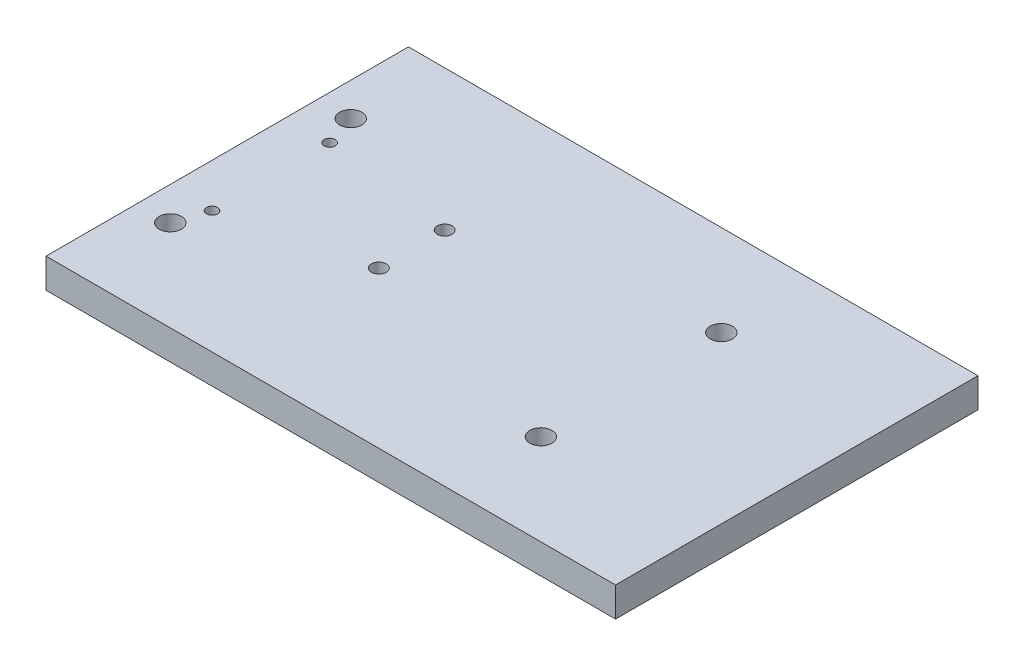
ISO-10303-21;
HEADER;
FILE_DESCRIPTION(('STEP AP214'),'2;1');
FILE_NAME('part.step','',(''),(''),'','','');
FILE_SCHEMA(('AUTOMOTIVE_DESIGN { 1 0 10303 214 1 1 1 1 }'));
ENDSEC;
DATA;
#1=APPLICATION_CONTEXT('core data for automotive mechanical design processes');
#2=APPLICATION_PROTOCOL_DEFINITION('international standard','automotive_design',2000,#1);
#3=PRODUCT_CONTEXT('',#1,'mechanical');
#4=PRODUCT('Part','Part','',(#3));
#5=PRODUCT_RELATED_PRODUCT_CATEGORY('part','',(#4));
#6=PRODUCT_DEFINITION_FORMATION('','',#4);
#7=PRODUCT_DEFINITION_CONTEXT('part definition',#1,'design');
#8=PRODUCT_DEFINITION('design','',#6,#7);
#9=PRODUCT_DEFINITION_SHAPE('','',#8);
#10=(LENGTH_UNIT() NAMED_UNIT(*) SI_UNIT(.MILLI.,.METRE.));
#11=(NAMED_UNIT(*) PLANE_ANGLE_UNIT() SI_UNIT($,.RADIAN.));
#12=(NAMED_UNIT(*) SI_UNIT($,.STERADIAN.) SOLID_ANGLE_UNIT());
#13=UNCERTAINTY_MEASURE_WITH_UNIT(LENGTH_MEASURE(1.E-05),#10,'distance_accuracy_value','');
#14=(GEOMETRIC_REPRESENTATION_CONTEXT(3) GLOBAL_UNCERTAINTY_ASSIGNED_CONTEXT((#13)) GLOBAL_UNIT_ASSIGNED_CONTEXT((#10,
#11,#12)) REPRESENTATION_CONTEXT('',''));
#15=CARTESIAN_POINT('',(0.,0.,0.));
#16=DIRECTION('',(0.,0.,1.));
#17=DIRECTION('',(1.,0.,0.));
#18=AXIS2_PLACEMENT_3D('',#15,#16,#17);
#19=CARTESIAN_POINT('',(38.5,4.,-24.5));
#20=DIRECTION('',(-1.,0.,0.));
#21=DIRECTION('',(0.,0.,1.));
#22=AXIS2_PLACEMENT_3D('',#19,#20,#21);
#23=PLANE('',#22);
#24=DIRECTION('',(0.,0.,-1.));
#25=VECTOR('',#24,1.);
#26=CARTESIAN_POINT('',(38.5,0.,-24.5));
#27=LINE('',#26,#25);
#28=CARTESIAN_POINT('',(38.5,0.,24.5));
#29=VERTEX_POINT('',#28);
#30=CARTESIAN_POINT('',(38.5,0.,-24.5));
#31=VERTEX_POINT('',#30);
#32=EDGE_CURVE('E96',#29,#31,#27,.T.);
#33=ORIENTED_EDGE('',*,*,#32,.T.);
#34=DIRECTION('',(0.,-1.,0.));
#35=VECTOR('',#34,1.);
#36=CARTESIAN_POINT('',(38.5,4.,-24.5));
#37=LINE('',#36,#35);
#38=CARTESIAN_POINT('',(38.5,4.,-24.5));
#39=VERTEX_POINT('',#38);
#40=EDGE_CURVE('E11',#39,#31,#37,.T.);
#41=ORIENTED_EDGE('',*,*,#40,.F.);
#42=DIRECTION('',(0.,0.,-1.));
#43=VECTOR('',#42,1.);
#44=CARTESIAN_POINT('',(38.5,4.,-24.5));
#45=LINE('',#44,#43);
#46=CARTESIAN_POINT('',(38.5,4.,24.5));
#47=VERTEX_POINT('',#46);
#48=EDGE_CURVE('E84',#47,#39,#45,.T.);
#49=ORIENTED_EDGE('',*,*,#48,.F.);
#50=DIRECTION('',(0.,-1.,0.));
#51=VECTOR('',#50,1.);
#52=CARTESIAN_POINT('',(38.5,4.,24.5));
#53=LINE('',#52,#51);
#54=EDGE_CURVE('E92',#47,#29,#53,.T.);
#55=ORIENTED_EDGE('',*,*,#54,.T.);
#56=EDGE_LOOP('',(#33,#41,#49,#55));
#57=FACE_BOUND('',#56,.T.);
#58=ADVANCED_FACE('F33',(#57),#23,.F.);
#59=CARTESIAN_POINT('',(-38.5,4.,-24.5));
#60=DIRECTION('',(0.,0.,1.));
#61=DIRECTION('',(1.,0.,0.));
#62=AXIS2_PLACEMENT_3D('',#59,#60,#61);
#63=PLANE('',#62);
#64=DIRECTION('',(-1.,0.,0.));
#65=VECTOR('',#64,1.);
#66=CARTESIAN_POINT('',(-38.5,0.,-24.5));
#67=LINE('',#66,#65);
#68=CARTESIAN_POINT('',(-38.5,0.,-24.5));
#69=VERTEX_POINT('',#68);
#70=EDGE_CURVE('E88',#31,#69,#67,.T.);
#71=ORIENTED_EDGE('',*,*,#70,.T.);
#72=DIRECTION('',(0.,-1.,0.));
#73=VECTOR('',#72,1.);
#74=CARTESIAN_POINT('',(-38.5,4.,-24.5));
#75=LINE('',#74,#73);
#76=CARTESIAN_POINT('',(-38.5,4.,-24.5));
#77=VERTEX_POINT('',#76);
#78=EDGE_CURVE('E41',#77,#69,#75,.T.);
#79=ORIENTED_EDGE('',*,*,#78,.F.);
#80=DIRECTION('',(-1.,0.,0.));
#81=VECTOR('',#80,1.);
#82=CARTESIAN_POINT('',(-38.5,4.,-24.5));
#83=LINE('',#82,#81);
#84=EDGE_CURVE('E79',#39,#77,#83,.T.);
#85=ORIENTED_EDGE('',*,*,#84,.F.);
#86=ORIENTED_EDGE('',*,*,#40,.T.);
#87=EDGE_LOOP('',(#71,#79,#85,#86));
#88=FACE_BOUND('',#87,.T.);
#89=ADVANCED_FACE('F87',(#88),#63,.F.);
#90=CARTESIAN_POINT('',(-38.5,4.,-24.5));
#91=DIRECTION('',(1.,0.,0.));
#92=DIRECTION('',(0.,0.,-1.));
#93=AXIS2_PLACEMENT_3D('',#90,#91,#92);
#94=PLANE('',#93);
#95=DIRECTION('',(0.,0.,1.));
#96=VECTOR('',#95,1.);
#97=CARTESIAN_POINT('',(-38.5,0.,-24.5));
#98=LINE('',#97,#96);
#99=CARTESIAN_POINT('',(-38.5,0.,24.5));
#100=VERTEX_POINT('',#99);
#101=EDGE_CURVE('E66',#69,#100,#98,.T.);
#102=ORIENTED_EDGE('',*,*,#101,.T.);
#103=DIRECTION('',(0.,-1.,0.));
#104=VECTOR('',#103,1.);
#105=CARTESIAN_POINT('',(-38.5,4.,24.5));
#106=LINE('',#105,#104);
#107=CARTESIAN_POINT('',(-38.5,4.,24.5));
#108=VERTEX_POINT('',#107);
#109=EDGE_CURVE('E89',#108,#100,#106,.T.);
#110=ORIENTED_EDGE('',*,*,#109,.F.);
#111=DIRECTION('',(0.,0.,1.));
#112=VECTOR('',#111,1.);
#113=CARTESIAN_POINT('',(-38.5,4.,-24.5));
#114=LINE('',#113,#112);
#115=EDGE_CURVE('E82',#77,#108,#114,.T.);
#116=ORIENTED_EDGE('',*,*,#115,.F.);
#117=ORIENTED_EDGE('',*,*,#78,.T.);
#118=EDGE_LOOP('',(#102,#110,#116,#117));
#119=FACE_BOUND('',#118,.T.);
#120=ADVANCED_FACE('F90',(#119),#94,.F.);
#121=CARTESIAN_POINT('',(-38.5,4.,24.5));
#122=DIRECTION('',(0.,0.,-1.));
#123=DIRECTION('',(-1.,0.,0.));
#124=AXIS2_PLACEMENT_3D('',#121,#122,#123);
#125=PLANE('',#124);
#126=DIRECTION('',(1.,0.,0.));
#127=VECTOR('',#126,1.);
#128=CARTESIAN_POINT('',(-38.5,0.,24.5));
#129=LINE('',#128,#127);
#130=EDGE_CURVE('E72',#100,#29,#129,.T.);
#131=ORIENTED_EDGE('',*,*,#130,.T.);
#132=ORIENTED_EDGE('',*,*,#54,.F.);
#133=DIRECTION('',(1.,0.,0.));
#134=VECTOR('',#133,1.);
#135=CARTESIAN_POINT('',(-38.5,4.,24.5));
#136=LINE('',#135,#134);
#137=EDGE_CURVE('E49',#108,#47,#136,.T.);
#138=ORIENTED_EDGE('',*,*,#137,.F.);
#139=ORIENTED_EDGE('',*,*,#109,.T.);
#140=EDGE_LOOP('',(#131,#132,#138,#139));
#141=FACE_BOUND('',#140,.T.);
#142=ADVANCED_FACE('F104',(#141),#125,.F.);
#143=CARTESIAN_POINT('',(0.,4.,0.));
#144=DIRECTION('',(0.,1.,0.));
#145=DIRECTION('',(0.,0.,1.));
#146=AXIS2_PLACEMENT_3D('',#143,#144,#145);
#147=PLANE('',#146);
#148=CARTESIAN_POINT('',(16.1,4.,12.2));
#149=DIRECTION('',(0.,1.,0.));
#150=DIRECTION('',(0.,0.,1.));
#151=AXIS2_PLACEMENT_3D('',#148,#149,#150);
#152=CIRCLE('',#151,1.5);
#153=CARTESIAN_POINT('',(16.1,4.,13.7));
#154=VERTEX_POINT('',#153);
#155=EDGE_CURVE('E135',#154,#154,#152,.T.);
#156=ORIENTED_EDGE('',*,*,#155,.F.);
#157=EDGE_LOOP('',(#156));
#158=FACE_BOUND('',#157,.T.);
#159=CARTESIAN_POINT('',(16.0999999999999,4.,-12.2));
#160=DIRECTION('',(0.,1.,0.));
#161=DIRECTION('',(0.,0.,1.));
#162=AXIS2_PLACEMENT_3D('',#159,#160,#161);
#163=CIRCLE('',#162,1.5);
#164=CARTESIAN_POINT('',(16.0999999999999,4.,-10.7));
#165=VERTEX_POINT('',#164);
#166=EDGE_CURVE('E129',#165,#165,#163,.T.);
#167=ORIENTED_EDGE('',*,*,#166,.F.);
#168=EDGE_LOOP('',(#167));
#169=FACE_BOUND('',#168,.T.);
#170=CARTESIAN_POINT('',(-34.0000000000001,4.,-12.2));
#171=DIRECTION('',(0.,1.,0.));
#172=DIRECTION('',(0.,0.,1.));
#173=AXIS2_PLACEMENT_3D('',#170,#171,#172);
#174=CIRCLE('',#173,1.5);
#175=CARTESIAN_POINT('',(-34.0000000000001,4.,-10.7));
#176=VERTEX_POINT('',#175);
#177=EDGE_CURVE('E123',#176,#176,#174,.T.);
#178=ORIENTED_EDGE('',*,*,#177,.F.);
#179=EDGE_LOOP('',(#178));
#180=FACE_BOUND('',#179,.T.);
#181=CARTESIAN_POINT('',(-32.6000000000001,4.,-7.94999999999999));
#182=DIRECTION('',(0.,1.,0.));
#183=DIRECTION('',(0.,0.,1.));
#184=AXIS2_PLACEMENT_3D('',#181,#182,#183);
#185=CIRCLE('',#184,0.749999999999999);
#186=CARTESIAN_POINT('',(-32.6000000000001,4.,-7.19999999999999));
#187=VERTEX_POINT('',#186);
#188=EDGE_CURVE('E116',#187,#187,#185,.T.);
#189=ORIENTED_EDGE('',*,*,#188,.F.);
#190=EDGE_LOOP('',(#189));
#191=FACE_BOUND('',#190,.T.);
#192=CARTESIAN_POINT('',(-14.6000000000001,4.,3.40000000000001));
#193=DIRECTION('',(0.,1.,0.));
#194=DIRECTION('',(0.,0.,1.));
#195=AXIS2_PLACEMENT_3D('',#192,#193,#194);
#196=CIRCLE('',#195,1.);
#197=CARTESIAN_POINT('',(-14.6000000000001,4.,4.40000000000001));
#198=VERTEX_POINT('',#197);
#199=EDGE_CURVE('E152',#198,#198,#196,.T.);
#200=ORIENTED_EDGE('',*,*,#199,.F.);
#201=EDGE_LOOP('',(#200));
#202=FACE_BOUND('',#201,.T.);
#203=CARTESIAN_POINT('',(-14.6000000000001,4.,-5.49999999999999));
#204=DIRECTION('',(0.,1.,0.));
#205=DIRECTION('',(0.,0.,1.));
#206=AXIS2_PLACEMENT_3D('',#203,#204,#205);
#207=CIRCLE('',#206,1.);
#208=CARTESIAN_POINT('',(-14.6000000000001,4.,-4.49999999999999));
#209=VERTEX_POINT('',#208);
#210=EDGE_CURVE('E140',#209,#209,#207,.T.);
#211=ORIENTED_EDGE('',*,*,#210,.F.);
#212=EDGE_LOOP('',(#211));
#213=FACE_BOUND('',#212,.T.);
#214=CARTESIAN_POINT('',(-32.6,4.,7.95000000000001));
#215=DIRECTION('',(0.,1.,0.));
#216=DIRECTION('',(0.,0.,1.));
#217=AXIS2_PLACEMENT_3D('',#214,#215,#216);
#218=CIRCLE('',#217,0.749999999999999);
#219=CARTESIAN_POINT('',(-32.6,4.,8.70000000000001));
#220=VERTEX_POINT('',#219);
#221=EDGE_CURVE('E147',#220,#220,#218,.T.);
#222=ORIENTED_EDGE('',*,*,#221,.F.);
#223=EDGE_LOOP('',(#222));
#224=FACE_BOUND('',#223,.T.);
#225=CARTESIAN_POINT('',(-34.,4.,12.2));
#226=DIRECTION('',(0.,1.,0.));
#227=DIRECTION('',(0.,0.,1.));
#228=AXIS2_PLACEMENT_3D('',#225,#226,#227);
#229=CIRCLE('',#228,1.5);
#230=CARTESIAN_POINT('',(-34.,4.,13.7));
#231=VERTEX_POINT('',#230);
#232=EDGE_CURVE('E110',#231,#231,#229,.T.);
#233=ORIENTED_EDGE('',*,*,#232,.F.);
#234=EDGE_LOOP('',(#233));
#235=FACE_BOUND('',#234,.T.);
#236=ORIENTED_EDGE('',*,*,#48,.T.);
#237=ORIENTED_EDGE('',*,*,#84,.T.);
#238=ORIENTED_EDGE('',*,*,#115,.T.);
#239=ORIENTED_EDGE('',*,*,#137,.T.);
#240=EDGE_LOOP('',(#236,#237,#238,#239));
#241=FACE_BOUND('',#240,.T.);
#242=ADVANCED_FACE('F80',(#158,#169,#180,#191,#202,#213,#224,#235,#241),#147,.T.);
#243=CARTESIAN_POINT('',(0.,0.,0.));
#244=DIRECTION('',(0.,1.,0.));
#245=DIRECTION('',(0.,0.,1.));
#246=AXIS2_PLACEMENT_3D('',#243,#244,#245);
#247=PLANE('',#246);
#248=CARTESIAN_POINT('',(16.1,0.,12.2));
#249=DIRECTION('',(0.,1.,0.));
#250=DIRECTION('',(0.,0.,1.));
#251=AXIS2_PLACEMENT_3D('',#248,#249,#250);
#252=CIRCLE('',#251,1.5);
#253=CARTESIAN_POINT('',(16.1,0.,13.7));
#254=VERTEX_POINT('',#253);
#255=EDGE_CURVE('E113',#254,#254,#252,.T.);
#256=ORIENTED_EDGE('',*,*,#255,.T.);
#257=EDGE_LOOP('',(#256));
#258=FACE_BOUND('',#257,.T.);
#259=CARTESIAN_POINT('',(16.0999999999999,0.,-12.2));
#260=DIRECTION('',(0.,1.,0.));
#261=DIRECTION('',(0.,0.,1.));
#262=AXIS2_PLACEMENT_3D('',#259,#260,#261);
#263=CIRCLE('',#262,1.5);
#264=CARTESIAN_POINT('',(16.0999999999999,0.,-10.7));
#265=VERTEX_POINT('',#264);
#266=EDGE_CURVE('E132',#265,#265,#263,.T.);
#267=ORIENTED_EDGE('',*,*,#266,.T.);
#268=EDGE_LOOP('',(#267));
#269=FACE_BOUND('',#268,.T.);
#270=CARTESIAN_POINT('',(-34.0000000000001,0.,-12.2));
#271=DIRECTION('',(0.,1.,0.));
#272=DIRECTION('',(0.,0.,1.));
#273=AXIS2_PLACEMENT_3D('',#270,#271,#272);
#274=CIRCLE('',#273,1.5);
#275=CARTESIAN_POINT('',(-34.0000000000001,0.,-10.7));
#276=VERTEX_POINT('',#275);
#277=EDGE_CURVE('E126',#276,#276,#274,.T.);
#278=ORIENTED_EDGE('',*,*,#277,.T.);
#279=EDGE_LOOP('',(#278));
#280=FACE_BOUND('',#279,.T.);
#281=CARTESIAN_POINT('',(-32.6000000000001,0.,-7.94999999999999));
#282=DIRECTION('',(0.,1.,0.));
#283=DIRECTION('',(0.,0.,1.));
#284=AXIS2_PLACEMENT_3D('',#281,#282,#283);
#285=CIRCLE('',#284,0.749999999999999);
#286=CARTESIAN_POINT('',(-32.6000000000001,0.,-7.19999999999999));
#287=VERTEX_POINT('',#286);
#288=EDGE_CURVE('E119',#287,#287,#285,.T.);
#289=ORIENTED_EDGE('',*,*,#288,.T.);
#290=EDGE_LOOP('',(#289));
#291=FACE_BOUND('',#290,.T.);
#292=CARTESIAN_POINT('',(-14.6000000000001,0.,3.40000000000001));
#293=DIRECTION('',(0.,1.,0.));
#294=DIRECTION('',(0.,0.,1.));
#295=AXIS2_PLACEMENT_3D('',#292,#293,#294);
#296=CIRCLE('',#295,1.);
#297=CARTESIAN_POINT('',(-14.6000000000001,0.,4.40000000000001));
#298=VERTEX_POINT('',#297);
#299=EDGE_CURVE('E144',#298,#298,#296,.T.);
#300=ORIENTED_EDGE('',*,*,#299,.T.);
#301=EDGE_LOOP('',(#300));
#302=FACE_BOUND('',#301,.T.);
#303=CARTESIAN_POINT('',(-14.6000000000001,0.,-5.49999999999999));
#304=DIRECTION('',(0.,1.,0.));
#305=DIRECTION('',(0.,0.,1.));
#306=AXIS2_PLACEMENT_3D('',#303,#304,#305);
#307=CIRCLE('',#306,1.);
#308=CARTESIAN_POINT('',(-14.6000000000001,0.,-4.49999999999999));
#309=VERTEX_POINT('',#308);
#310=EDGE_CURVE('E143',#309,#309,#307,.T.);
#311=ORIENTED_EDGE('',*,*,#310,.T.);
#312=EDGE_LOOP('',(#311));
#313=FACE_BOUND('',#312,.T.);
#314=CARTESIAN_POINT('',(-32.6,0.,7.95000000000001));
#315=DIRECTION('',(0.,1.,0.));
#316=DIRECTION('',(0.,0.,1.));
#317=AXIS2_PLACEMENT_3D('',#314,#315,#316);
#318=CIRCLE('',#317,0.749999999999999);
#319=CARTESIAN_POINT('',(-32.6,0.,8.70000000000001));
#320=VERTEX_POINT('',#319);
#321=EDGE_CURVE('E120',#320,#320,#318,.T.);
#322=ORIENTED_EDGE('',*,*,#321,.T.);
#323=EDGE_LOOP('',(#322));
#324=FACE_BOUND('',#323,.T.);
#325=CARTESIAN_POINT('',(-34.,0.,12.2));
#326=DIRECTION('',(0.,1.,0.));
#327=DIRECTION('',(0.,0.,1.));
#328=AXIS2_PLACEMENT_3D('',#325,#326,#327);
#329=CIRCLE('',#328,1.5);
#330=CARTESIAN_POINT('',(-34.,0.,13.7));
#331=VERTEX_POINT('',#330);
#332=EDGE_CURVE('E99',#331,#331,#329,.T.);
#333=ORIENTED_EDGE('',*,*,#332,.T.);
#334=EDGE_LOOP('',(#333));
#335=FACE_BOUND('',#334,.T.);
#336=ORIENTED_EDGE('',*,*,#32,.F.);
#337=ORIENTED_EDGE('',*,*,#130,.F.);
#338=ORIENTED_EDGE('',*,*,#101,.F.);
#339=ORIENTED_EDGE('',*,*,#70,.F.);
#340=EDGE_LOOP('',(#336,#337,#338,#339));
#341=FACE_BOUND('',#340,.T.);
#342=ADVANCED_FACE('F107',(#258,#269,#280,#291,#302,#313,#324,#335,#341),#247,.F.);
#343=CARTESIAN_POINT('',(-34.,0.,12.2));
#344=DIRECTION('',(0.,1.,0.));
#345=DIRECTION('',(0.,0.,1.));
#346=AXIS2_PLACEMENT_3D('',#343,#344,#345);
#347=CYLINDRICAL_SURFACE('',#346,1.5);
#348=ORIENTED_EDGE('',*,*,#332,.F.);
#349=EDGE_LOOP('',(#348));
#350=FACE_BOUND('',#349,.T.);
#351=ORIENTED_EDGE('',*,*,#232,.T.);
#352=EDGE_LOOP('',(#351));
#353=FACE_BOUND('',#352,.T.);
#354=ADVANCED_FACE('F178',(#350,#353),#347,.F.);
#355=CARTESIAN_POINT('',(-32.6,0.,7.95000000000001));
#356=DIRECTION('',(0.,1.,0.));
#357=DIRECTION('',(0.,0.,1.));
#358=AXIS2_PLACEMENT_3D('',#355,#356,#357);
#359=CYLINDRICAL_SURFACE('',#358,0.749999999999999);
#360=ORIENTED_EDGE('',*,*,#321,.F.);
#361=EDGE_LOOP('',(#360));
#362=FACE_BOUND('',#361,.T.);
#363=ORIENTED_EDGE('',*,*,#221,.T.);
#364=EDGE_LOOP('',(#363));
#365=FACE_BOUND('',#364,.T.);
#366=ADVANCED_FACE('F180',(#362,#365),#359,.F.);
#367=CARTESIAN_POINT('',(-14.6000000000001,0.,-5.49999999999999));
#368=DIRECTION('',(0.,1.,0.));
#369=DIRECTION('',(0.,0.,1.));
#370=AXIS2_PLACEMENT_3D('',#367,#368,#369);
#371=CYLINDRICAL_SURFACE('',#370,1.);
#372=ORIENTED_EDGE('',*,*,#310,.F.);
#373=EDGE_LOOP('',(#372));
#374=FACE_BOUND('',#373,.T.);
#375=ORIENTED_EDGE('',*,*,#210,.T.);
#376=EDGE_LOOP('',(#375));
#377=FACE_BOUND('',#376,.T.);
#378=ADVANCED_FACE('F164',(#374,#377),#371,.F.);
#379=CARTESIAN_POINT('',(-14.6000000000001,0.,3.40000000000001));
#380=DIRECTION('',(0.,1.,0.));
#381=DIRECTION('',(0.,0.,1.));
#382=AXIS2_PLACEMENT_3D('',#379,#380,#381);
#383=CYLINDRICAL_SURFACE('',#382,1.);
#384=ORIENTED_EDGE('',*,*,#299,.F.);
#385=EDGE_LOOP('',(#384));
#386=FACE_BOUND('',#385,.T.);
#387=ORIENTED_EDGE('',*,*,#199,.T.);
#388=EDGE_LOOP('',(#387));
#389=FACE_BOUND('',#388,.T.);
#390=ADVANCED_FACE('F160',(#386,#389),#383,.F.);
#391=CARTESIAN_POINT('',(-32.6000000000001,0.,-7.94999999999999));
#392=DIRECTION('',(0.,1.,0.));
#393=DIRECTION('',(0.,0.,1.));
#394=AXIS2_PLACEMENT_3D('',#391,#392,#393);
#395=CYLINDRICAL_SURFACE('',#394,0.749999999999999);
#396=ORIENTED_EDGE('',*,*,#288,.F.);
#397=EDGE_LOOP('',(#396));
#398=FACE_BOUND('',#397,.T.);
#399=ORIENTED_EDGE('',*,*,#188,.T.);
#400=EDGE_LOOP('',(#399));
#401=FACE_BOUND('',#400,.T.);
#402=ADVANCED_FACE('F163',(#398,#401),#395,.F.);
#403=CARTESIAN_POINT('',(-34.0000000000001,0.,-12.2));
#404=DIRECTION('',(0.,1.,0.));
#405=DIRECTION('',(0.,0.,1.));
#406=AXIS2_PLACEMENT_3D('',#403,#404,#405);
#407=CYLINDRICAL_SURFACE('',#406,1.5);
#408=ORIENTED_EDGE('',*,*,#277,.F.);
#409=EDGE_LOOP('',(#408));
#410=FACE_BOUND('',#409,.T.);
#411=ORIENTED_EDGE('',*,*,#177,.T.);
#412=EDGE_LOOP('',(#411));
#413=FACE_BOUND('',#412,.T.);
#414=ADVANCED_FACE('F249',(#410,#413),#407,.F.);
#415=CARTESIAN_POINT('',(16.0999999999999,0.,-12.2));
#416=DIRECTION('',(0.,1.,0.));
#417=DIRECTION('',(0.,0.,1.));
#418=AXIS2_PLACEMENT_3D('',#415,#416,#417);
#419=CYLINDRICAL_SURFACE('',#418,1.5);
#420=ORIENTED_EDGE('',*,*,#266,.F.);
#421=EDGE_LOOP('',(#420));
#422=FACE_BOUND('',#421,.T.);
#423=ORIENTED_EDGE('',*,*,#166,.T.);
#424=EDGE_LOOP('',(#423));
#425=FACE_BOUND('',#424,.T.);
#426=ADVANCED_FACE('F258',(#422,#425),#419,.F.);
#427=CARTESIAN_POINT('',(16.1,0.,12.2));
#428=DIRECTION('',(0.,1.,0.));
#429=DIRECTION('',(0.,0.,1.));
#430=AXIS2_PLACEMENT_3D('',#427,#428,#429);
#431=CYLINDRICAL_SURFACE('',#430,1.5);
#432=ORIENTED_EDGE('',*,*,#255,.F.);
#433=EDGE_LOOP('',(#432));
#434=FACE_BOUND('',#433,.T.);
#435=ORIENTED_EDGE('',*,*,#155,.T.);
#436=EDGE_LOOP('',(#435));
#437=FACE_BOUND('',#436,.T.);
#438=ADVANCED_FACE('F268',(#434,#437),#431,.F.);
#439=CLOSED_SHELL('',(#58,#89,#120,#142,#242,#342,#354,#366,#378,#390,#402,#414,#426,#438));
#440=MANIFOLD_SOLID_BREP('B2',#439);
#441=ADVANCED_BREP_SHAPE_REPRESENTATION('',(#18,#440),#14);
#442=SHAPE_DEFINITION_REPRESENTATION(#9,#441);
ENDSEC;
END-ISO-10303-21;
